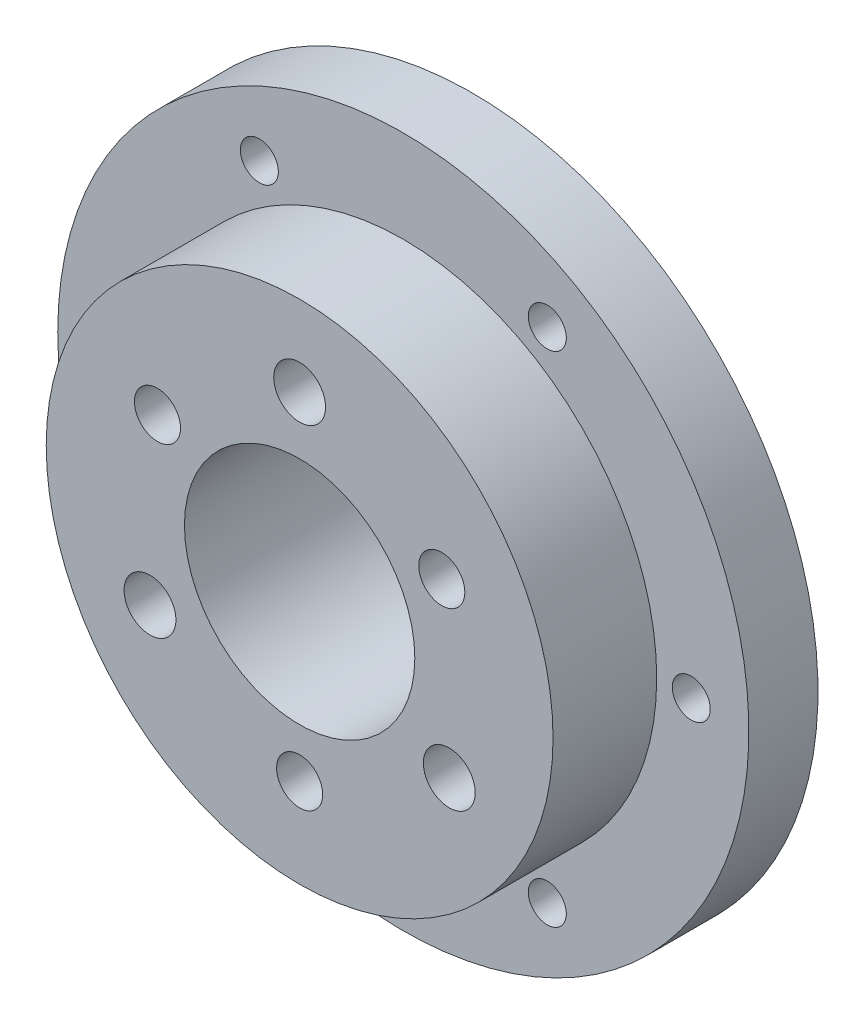
ISO-10303-21;
HEADER;
FILE_DESCRIPTION(('STEP AP214'),'2;1');
FILE_NAME('part.step','',(''),(''),'','','');
FILE_SCHEMA(('AUTOMOTIVE_DESIGN { 1 0 10303 214 1 1 1 1 }'));
ENDSEC;
DATA;
#1=APPLICATION_CONTEXT('core data for automotive mechanical design processes');
#2=APPLICATION_PROTOCOL_DEFINITION('international standard','automotive_design',2000,#1);
#3=PRODUCT_CONTEXT('',#1,'mechanical');
#4=PRODUCT('Part','Part','',(#3));
#5=PRODUCT_RELATED_PRODUCT_CATEGORY('part','',(#4));
#6=PRODUCT_DEFINITION_FORMATION('','',#4);
#7=PRODUCT_DEFINITION_CONTEXT('part definition',#1,'design');
#8=PRODUCT_DEFINITION('design','',#6,#7);
#9=PRODUCT_DEFINITION_SHAPE('','',#8);
#10=(LENGTH_UNIT() NAMED_UNIT(*) SI_UNIT(.MILLI.,.METRE.));
#11=(NAMED_UNIT(*) PLANE_ANGLE_UNIT() SI_UNIT($,.RADIAN.));
#12=(NAMED_UNIT(*) SI_UNIT($,.STERADIAN.) SOLID_ANGLE_UNIT());
#13=UNCERTAINTY_MEASURE_WITH_UNIT(LENGTH_MEASURE(1.E-05),#10,'distance_accuracy_value','');
#14=(GEOMETRIC_REPRESENTATION_CONTEXT(3) GLOBAL_UNCERTAINTY_ASSIGNED_CONTEXT((#13)) GLOBAL_UNIT_ASSIGNED_CONTEXT((#10,
#11,#12)) REPRESENTATION_CONTEXT('',''));
#15=CARTESIAN_POINT('',(0.,0.,0.));
#16=DIRECTION('',(0.,0.,1.));
#17=DIRECTION('',(1.,0.,0.));
#18=AXIS2_PLACEMENT_3D('',#15,#16,#17);
#19=CARTESIAN_POINT('',(0.,0.,0.));
#20=DIRECTION('',(0.,0.,1.));
#21=DIRECTION('',(1.,0.,0.));
#22=AXIS2_PLACEMENT_3D('',#19,#20,#21);
#23=PLANE('',#22);
#24=CARTESIAN_POINT('',(25.,0.,0.));
#25=DIRECTION('',(0.,0.,-1.));
#26=DIRECTION('',(-1.,0.,0.));
#27=AXIS2_PLACEMENT_3D('',#24,#25,#26);
#28=CIRCLE('',#27,1.65);
#29=CARTESIAN_POINT('',(23.35,0.,0.));
#30=VERTEX_POINT('',#29);
#31=EDGE_CURVE('E69',#30,#30,#28,.T.);
#32=ORIENTED_EDGE('',*,*,#31,.F.);
#33=EDGE_LOOP('',(#32));
#34=FACE_BOUND('',#33,.T.);
#35=CARTESIAN_POINT('',(12.5,21.650635094611,0.));
#36=DIRECTION('',(0.,0.,-1.));
#37=DIRECTION('',(-1.,0.,0.));
#38=AXIS2_PLACEMENT_3D('',#35,#36,#37);
#39=CIRCLE('',#38,1.65);
#40=CARTESIAN_POINT('',(10.85,21.650635094611,0.));
#41=VERTEX_POINT('',#40);
#42=EDGE_CURVE('E58',#41,#41,#39,.T.);
#43=ORIENTED_EDGE('',*,*,#42,.F.);
#44=EDGE_LOOP('',(#43));
#45=FACE_BOUND('',#44,.T.);
#46=CARTESIAN_POINT('',(-25.,-1.74574066942157E-13,0.));
#47=DIRECTION('',(0.,0.,-1.));
#48=DIRECTION('',(-1.,0.,0.));
#49=AXIS2_PLACEMENT_3D('',#46,#47,#48);
#50=CIRCLE('',#49,1.65);
#51=CARTESIAN_POINT('',(-26.65,-1.74574066942157E-13,0.));
#52=VERTEX_POINT('',#51);
#53=EDGE_CURVE('E74',#52,#52,#50,.T.);
#54=ORIENTED_EDGE('',*,*,#53,.F.);
#55=EDGE_LOOP('',(#54));
#56=FACE_BOUND('',#55,.T.);
#57=CARTESIAN_POINT('',(-12.4999999999998,-21.6506350946111,0.));
#58=DIRECTION('',(0.,0.,-1.));
#59=DIRECTION('',(-1.,0.,0.));
#60=AXIS2_PLACEMENT_3D('',#57,#58,#59);
#61=CIRCLE('',#60,1.65);
#62=CARTESIAN_POINT('',(-14.1499999999998,-21.6506350946111,0.));
#63=VERTEX_POINT('',#62);
#64=EDGE_CURVE('E80',#63,#63,#61,.T.);
#65=ORIENTED_EDGE('',*,*,#64,.F.);
#66=EDGE_LOOP('',(#65));
#67=FACE_BOUND('',#66,.T.);
#68=CARTESIAN_POINT('',(12.5000000000003,-21.6506350946108,0.));
#69=DIRECTION('',(0.,0.,-1.));
#70=DIRECTION('',(-1.,0.,0.));
#71=AXIS2_PLACEMENT_3D('',#68,#69,#70);
#72=CIRCLE('',#71,1.65);
#73=CARTESIAN_POINT('',(10.8500000000003,-21.6506350946108,0.));
#74=VERTEX_POINT('',#73);
#75=EDGE_CURVE('E86',#74,#74,#72,.T.);
#76=ORIENTED_EDGE('',*,*,#75,.F.);
#77=EDGE_LOOP('',(#76));
#78=FACE_BOUND('',#77,.T.);
#79=CARTESIAN_POINT('',(12.9903810567666,-7.50000000000001,0.));
#80=DIRECTION('',(0.,0.,-1.));
#81=DIRECTION('',(-1.,0.,0.));
#82=AXIS2_PLACEMENT_3D('',#79,#80,#81);
#83=CIRCLE('',#82,4.);
#84=CARTESIAN_POINT('',(8.99038105676658,-7.50000000000001,0.));
#85=VERTEX_POINT('',#84);
#86=EDGE_CURVE('E92',#85,#85,#83,.T.);
#87=ORIENTED_EDGE('',*,*,#86,.F.);
#88=EDGE_LOOP('',(#87));
#89=FACE_BOUND('',#88,.T.);
#90=CARTESIAN_POINT('',(-12.9903810567666,-7.5,0.));
#91=DIRECTION('',(0.,0.,-1.));
#92=DIRECTION('',(-1.,0.,0.));
#93=AXIS2_PLACEMENT_3D('',#90,#91,#92);
#94=CIRCLE('',#93,4.);
#95=CARTESIAN_POINT('',(-16.9903810567666,-7.5,0.));
#96=VERTEX_POINT('',#95);
#97=EDGE_CURVE('E104',#96,#96,#94,.T.);
#98=ORIENTED_EDGE('',*,*,#97,.F.);
#99=EDGE_LOOP('',(#98));
#100=FACE_BOUND('',#99,.T.);
#101=CARTESIAN_POINT('',(0.,15.,0.));
#102=DIRECTION('',(0.,0.,-1.));
#103=DIRECTION('',(-1.,0.,0.));
#104=AXIS2_PLACEMENT_3D('',#101,#102,#103);
#105=CIRCLE('',#104,4.);
#106=CARTESIAN_POINT('',(-4.,15.,0.));
#107=VERTEX_POINT('',#106);
#108=EDGE_CURVE('E116',#107,#107,#105,.T.);
#109=ORIENTED_EDGE('',*,*,#108,.F.);
#110=EDGE_LOOP('',(#109));
#111=FACE_BOUND('',#110,.T.);
#112=CARTESIAN_POINT('',(0.,0.,0.));
#113=DIRECTION('',(0.,0.,-1.));
#114=DIRECTION('',(-1.,0.,0.));
#115=AXIS2_PLACEMENT_3D('',#112,#113,#114);
#116=CIRCLE('',#115,10.);
#117=CARTESIAN_POINT('',(-10.,0.,0.));
#118=VERTEX_POINT('',#117);
#119=EDGE_CURVE('E128',#118,#118,#116,.T.);
#120=ORIENTED_EDGE('',*,*,#119,.F.);
#121=EDGE_LOOP('',(#120));
#122=FACE_BOUND('',#121,.T.);
#123=CARTESIAN_POINT('',(-12.3408620039283,7.125,0.));
#124=DIRECTION('',(0.,0.,1.));
#125=DIRECTION('',(1.,0.,0.));
#126=AXIS2_PLACEMENT_3D('',#123,#124,#125);
#127=CIRCLE('',#126,2.);
#128=CARTESIAN_POINT('',(-10.3408620039283,7.125,0.));
#129=VERTEX_POINT('',#128);
#130=EDGE_CURVE('E135',#129,#129,#127,.T.);
#131=ORIENTED_EDGE('',*,*,#130,.T.);
#132=EDGE_LOOP('',(#131));
#133=FACE_BOUND('',#132,.T.);
#134=CARTESIAN_POINT('',(12.3408620039283,7.125,0.));
#135=DIRECTION('',(0.,0.,1.));
#136=DIRECTION('',(1.,0.,0.));
#137=AXIS2_PLACEMENT_3D('',#134,#135,#136);
#138=CIRCLE('',#137,2.);
#139=CARTESIAN_POINT('',(14.3408620039283,7.125,0.));
#140=VERTEX_POINT('',#139);
#141=EDGE_CURVE('E139',#140,#140,#138,.T.);
#142=ORIENTED_EDGE('',*,*,#141,.T.);
#143=EDGE_LOOP('',(#142));
#144=FACE_BOUND('',#143,.T.);
#145=CARTESIAN_POINT('',(0.,-14.25,0.));
#146=DIRECTION('',(0.,0.,1.));
#147=DIRECTION('',(1.,0.,0.));
#148=AXIS2_PLACEMENT_3D('',#145,#146,#147);
#149=CIRCLE('',#148,2.);
#150=CARTESIAN_POINT('',(2.,-14.25,0.));
#151=VERTEX_POINT('',#150);
#152=EDGE_CURVE('E132',#151,#151,#149,.T.);
#153=ORIENTED_EDGE('',*,*,#152,.T.);
#154=EDGE_LOOP('',(#153));
#155=FACE_BOUND('',#154,.T.);
#156=CARTESIAN_POINT('',(0.,0.,0.));
#157=DIRECTION('',(0.,0.,-1.));
#158=DIRECTION('',(-1.,0.,0.));
#159=AXIS2_PLACEMENT_3D('',#156,#157,#158);
#160=CIRCLE('',#159,30.);
#161=CARTESIAN_POINT('',(-30.,0.,0.));
#162=VERTEX_POINT('',#161);
#163=EDGE_CURVE('E152',#162,#162,#160,.T.);
#164=ORIENTED_EDGE('',*,*,#163,.T.);
#165=EDGE_LOOP('',(#164));
#166=FACE_BOUND('',#165,.T.);
#167=CARTESIAN_POINT('',(-12.5000000000001,21.6506350946109,0.));
#168=DIRECTION('',(0.,0.,-1.));
#169=DIRECTION('',(-1.,0.,0.));
#170=AXIS2_PLACEMENT_3D('',#167,#168,#169);
#171=CIRCLE('',#170,1.65);
#172=CARTESIAN_POINT('',(-14.1500000000001,21.6506350946109,0.));
#173=VERTEX_POINT('',#172);
#174=EDGE_CURVE('E57',#173,#173,#171,.T.);
#175=ORIENTED_EDGE('',*,*,#174,.F.);
#176=EDGE_LOOP('',(#175));
#177=FACE_BOUND('',#176,.T.);
#178=ADVANCED_FACE('F39',(#34,#45,#56,#67,#78,#89,#100,#111,#122,#133,#144,#155,#166,#177),#23,.F.);
#179=CARTESIAN_POINT('',(0.,0.,15.));
#180=DIRECTION('',(0.,0.,-1.));
#181=DIRECTION('',(-1.,0.,0.));
#182=AXIS2_PLACEMENT_3D('',#179,#180,#181);
#183=CYLINDRICAL_SURFACE('',#182,22.);
#184=CARTESIAN_POINT('',(0.,0.,15.));
#185=DIRECTION('',(0.,0.,1.));
#186=DIRECTION('',(1.,0.,0.));
#187=AXIS2_PLACEMENT_3D('',#184,#185,#186);
#188=CIRCLE('',#187,22.);
#189=CARTESIAN_POINT('',(22.,0.,15.));
#190=VERTEX_POINT('',#189);
#191=EDGE_CURVE('E47',#190,#190,#188,.T.);
#192=ORIENTED_EDGE('',*,*,#191,.F.);
#193=EDGE_LOOP('',(#192));
#194=FACE_BOUND('',#193,.T.);
#195=CARTESIAN_POINT('',(0.,0.,6.));
#196=DIRECTION('',(0.,0.,-1.));
#197=DIRECTION('',(-1.,0.,0.));
#198=AXIS2_PLACEMENT_3D('',#195,#196,#197);
#199=CIRCLE('',#198,22.);
#200=CARTESIAN_POINT('',(-22.,0.,6.));
#201=VERTEX_POINT('',#200);
#202=EDGE_CURVE('E10',#201,#201,#199,.T.);
#203=ORIENTED_EDGE('',*,*,#202,.F.);
#204=EDGE_LOOP('',(#203));
#205=FACE_BOUND('',#204,.T.);
#206=ADVANCED_FACE('F41',(#194,#205),#183,.T.);
#207=CARTESIAN_POINT('',(0.,0.,15.));
#208=DIRECTION('',(0.,0.,1.));
#209=DIRECTION('',(1.,0.,0.));
#210=AXIS2_PLACEMENT_3D('',#207,#208,#209);
#211=PLANE('',#210);
#212=CARTESIAN_POINT('',(12.9903810567666,-7.50000000000001,15.));
#213=DIRECTION('',(0.,0.,-1.));
#214=DIRECTION('',(-1.,0.,0.));
#215=AXIS2_PLACEMENT_3D('',#212,#213,#214);
#216=CIRCLE('',#215,2.25);
#217=CARTESIAN_POINT('',(10.7403810567666,-7.50000000000001,15.));
#218=VERTEX_POINT('',#217);
#219=EDGE_CURVE('E101',#218,#218,#216,.T.);
#220=ORIENTED_EDGE('',*,*,#219,.T.);
#221=EDGE_LOOP('',(#220));
#222=FACE_BOUND('',#221,.T.);
#223=CARTESIAN_POINT('',(-12.9903810567666,-7.5,15.));
#224=DIRECTION('',(0.,0.,-1.));
#225=DIRECTION('',(-1.,0.,0.));
#226=AXIS2_PLACEMENT_3D('',#223,#224,#225);
#227=CIRCLE('',#226,2.25);
#228=CARTESIAN_POINT('',(-15.2403810567666,-7.5,15.));
#229=VERTEX_POINT('',#228);
#230=EDGE_CURVE('E113',#229,#229,#227,.T.);
#231=ORIENTED_EDGE('',*,*,#230,.T.);
#232=EDGE_LOOP('',(#231));
#233=FACE_BOUND('',#232,.T.);
#234=CARTESIAN_POINT('',(0.,15.,15.));
#235=DIRECTION('',(0.,0.,-1.));
#236=DIRECTION('',(-1.,0.,0.));
#237=AXIS2_PLACEMENT_3D('',#234,#235,#236);
#238=CIRCLE('',#237,2.25);
#239=CARTESIAN_POINT('',(-2.25,15.,15.));
#240=VERTEX_POINT('',#239);
#241=EDGE_CURVE('E125',#240,#240,#238,.T.);
#242=ORIENTED_EDGE('',*,*,#241,.T.);
#243=EDGE_LOOP('',(#242));
#244=FACE_BOUND('',#243,.T.);
#245=CARTESIAN_POINT('',(0.,0.,15.));
#246=DIRECTION('',(0.,0.,-1.));
#247=DIRECTION('',(-1.,0.,0.));
#248=AXIS2_PLACEMENT_3D('',#245,#246,#247);
#249=CIRCLE('',#248,10.);
#250=CARTESIAN_POINT('',(-10.,0.,15.));
#251=VERTEX_POINT('',#250);
#252=EDGE_CURVE('E129',#251,#251,#249,.T.);
#253=ORIENTED_EDGE('',*,*,#252,.T.);
#254=EDGE_LOOP('',(#253));
#255=FACE_BOUND('',#254,.T.);
#256=CARTESIAN_POINT('',(-12.3408620039283,7.125,15.));
#257=DIRECTION('',(0.,0.,1.));
#258=DIRECTION('',(1.,0.,0.));
#259=AXIS2_PLACEMENT_3D('',#256,#257,#258);
#260=CIRCLE('',#259,2.);
#261=CARTESIAN_POINT('',(-10.3408620039283,7.125,15.));
#262=VERTEX_POINT('',#261);
#263=EDGE_CURVE('E149',#262,#262,#260,.T.);
#264=ORIENTED_EDGE('',*,*,#263,.F.);
#265=EDGE_LOOP('',(#264));
#266=FACE_BOUND('',#265,.T.);
#267=CARTESIAN_POINT('',(12.3408620039283,7.125,15.));
#268=DIRECTION('',(0.,0.,1.));
#269=DIRECTION('',(1.,0.,0.));
#270=AXIS2_PLACEMENT_3D('',#267,#268,#269);
#271=CIRCLE('',#270,2.);
#272=CARTESIAN_POINT('',(14.3408620039283,7.125,15.));
#273=VERTEX_POINT('',#272);
#274=EDGE_CURVE('E146',#273,#273,#271,.T.);
#275=ORIENTED_EDGE('',*,*,#274,.F.);
#276=EDGE_LOOP('',(#275));
#277=FACE_BOUND('',#276,.T.);
#278=CARTESIAN_POINT('',(0.,-14.25,15.));
#279=DIRECTION('',(0.,0.,1.));
#280=DIRECTION('',(1.,0.,0.));
#281=AXIS2_PLACEMENT_3D('',#278,#279,#280);
#282=CIRCLE('',#281,2.);
#283=CARTESIAN_POINT('',(2.,-14.25,15.));
#284=VERTEX_POINT('',#283);
#285=EDGE_CURVE('E138',#284,#284,#282,.T.);
#286=ORIENTED_EDGE('',*,*,#285,.F.);
#287=EDGE_LOOP('',(#286));
#288=FACE_BOUND('',#287,.T.);
#289=ORIENTED_EDGE('',*,*,#191,.T.);
#290=EDGE_LOOP('',(#289));
#291=FACE_BOUND('',#290,.T.);
#292=ADVANCED_FACE('F162',(#222,#233,#244,#255,#266,#277,#288,#291),#211,.T.);
#293=CARTESIAN_POINT('',(0.,0.,6.));
#294=DIRECTION('',(0.,0.,-1.));
#295=DIRECTION('',(-1.,0.,0.));
#296=AXIS2_PLACEMENT_3D('',#293,#294,#295);
#297=CYLINDRICAL_SURFACE('',#296,30.);
#298=CARTESIAN_POINT('',(0.,0.,6.));
#299=DIRECTION('',(0.,0.,-1.));
#300=DIRECTION('',(-1.,0.,0.));
#301=AXIS2_PLACEMENT_3D('',#298,#299,#300);
#302=CIRCLE('',#301,30.);
#303=CARTESIAN_POINT('',(-30.,0.,6.));
#304=VERTEX_POINT('',#303);
#305=EDGE_CURVE('E52',#304,#304,#302,.T.);
#306=ORIENTED_EDGE('',*,*,#305,.T.);
#307=EDGE_LOOP('',(#306));
#308=FACE_BOUND('',#307,.T.);
#309=ORIENTED_EDGE('',*,*,#163,.F.);
#310=EDGE_LOOP('',(#309));
#311=FACE_BOUND('',#310,.T.);
#312=ADVANCED_FACE('F159',(#308,#311),#297,.T.);
#313=CARTESIAN_POINT('',(0.,0.,6.));
#314=DIRECTION('',(0.,0.,-1.));
#315=DIRECTION('',(-1.,0.,0.));
#316=AXIS2_PLACEMENT_3D('',#313,#314,#315);
#317=PLANE('',#316);
#318=CARTESIAN_POINT('',(25.,0.,6.));
#319=DIRECTION('',(0.,0.,-1.));
#320=DIRECTION('',(-1.,0.,0.));
#321=AXIS2_PLACEMENT_3D('',#318,#319,#320);
#322=CIRCLE('',#321,1.65);
#323=CARTESIAN_POINT('',(23.35,0.,6.));
#324=VERTEX_POINT('',#323);
#325=EDGE_CURVE('E43',#324,#324,#322,.T.);
#326=ORIENTED_EDGE('',*,*,#325,.T.);
#327=EDGE_LOOP('',(#326));
#328=FACE_BOUND('',#327,.T.);
#329=CARTESIAN_POINT('',(12.5,21.650635094611,6.));
#330=DIRECTION('',(0.,0.,-1.));
#331=DIRECTION('',(-1.,0.,0.));
#332=AXIS2_PLACEMENT_3D('',#329,#330,#331);
#333=CIRCLE('',#332,1.65);
#334=CARTESIAN_POINT('',(10.85,21.650635094611,6.));
#335=VERTEX_POINT('',#334);
#336=EDGE_CURVE('E55',#335,#335,#333,.T.);
#337=ORIENTED_EDGE('',*,*,#336,.T.);
#338=EDGE_LOOP('',(#337));
#339=FACE_BOUND('',#338,.T.);
#340=CARTESIAN_POINT('',(-12.5000000000001,21.6506350946109,6.));
#341=DIRECTION('',(0.,0.,-1.));
#342=DIRECTION('',(-1.,0.,0.));
#343=AXIS2_PLACEMENT_3D('',#340,#341,#342);
#344=CIRCLE('',#343,1.65);
#345=CARTESIAN_POINT('',(-14.1500000000001,21.6506350946109,6.));
#346=VERTEX_POINT('',#345);
#347=EDGE_CURVE('E62',#346,#346,#344,.T.);
#348=ORIENTED_EDGE('',*,*,#347,.T.);
#349=EDGE_LOOP('',(#348));
#350=FACE_BOUND('',#349,.T.);
#351=CARTESIAN_POINT('',(-25.,-1.74574066942157E-13,6.));
#352=DIRECTION('',(0.,0.,-1.));
#353=DIRECTION('',(-1.,0.,0.));
#354=AXIS2_PLACEMENT_3D('',#351,#352,#353);
#355=CIRCLE('',#354,1.65);
#356=CARTESIAN_POINT('',(-26.65,-1.74574066942157E-13,6.));
#357=VERTEX_POINT('',#356);
#358=EDGE_CURVE('E77',#357,#357,#355,.T.);
#359=ORIENTED_EDGE('',*,*,#358,.T.);
#360=EDGE_LOOP('',(#359));
#361=FACE_BOUND('',#360,.T.);
#362=CARTESIAN_POINT('',(-12.4999999999998,-21.6506350946111,6.));
#363=DIRECTION('',(0.,0.,-1.));
#364=DIRECTION('',(-1.,0.,0.));
#365=AXIS2_PLACEMENT_3D('',#362,#363,#364);
#366=CIRCLE('',#365,1.65);
#367=CARTESIAN_POINT('',(-14.1499999999998,-21.6506350946111,6.));
#368=VERTEX_POINT('',#367);
#369=EDGE_CURVE('E83',#368,#368,#366,.T.);
#370=ORIENTED_EDGE('',*,*,#369,.T.);
#371=EDGE_LOOP('',(#370));
#372=FACE_BOUND('',#371,.T.);
#373=CARTESIAN_POINT('',(12.5000000000003,-21.6506350946108,6.));
#374=DIRECTION('',(0.,0.,-1.));
#375=DIRECTION('',(-1.,0.,0.));
#376=AXIS2_PLACEMENT_3D('',#373,#374,#375);
#377=CIRCLE('',#376,1.65);
#378=CARTESIAN_POINT('',(10.8500000000003,-21.6506350946108,6.));
#379=VERTEX_POINT('',#378);
#380=EDGE_CURVE('E89',#379,#379,#377,.T.);
#381=ORIENTED_EDGE('',*,*,#380,.T.);
#382=EDGE_LOOP('',(#381));
#383=FACE_BOUND('',#382,.T.);
#384=ORIENTED_EDGE('',*,*,#202,.T.);
#385=EDGE_LOOP('',(#384));
#386=FACE_BOUND('',#385,.T.);
#387=ORIENTED_EDGE('',*,*,#305,.F.);
#388=EDGE_LOOP('',(#387));
#389=FACE_BOUND('',#388,.T.);
#390=ADVANCED_FACE('F161',(#328,#339,#350,#361,#372,#383,#386,#389),#317,.F.);
#391=CARTESIAN_POINT('',(0.,-14.25,0.));
#392=DIRECTION('',(0.,0.,1.));
#393=DIRECTION('',(1.,0.,0.));
#394=AXIS2_PLACEMENT_3D('',#391,#392,#393);
#395=CYLINDRICAL_SURFACE('',#394,2.);
#396=ORIENTED_EDGE('',*,*,#285,.T.);
#397=EDGE_LOOP('',(#396));
#398=FACE_BOUND('',#397,.T.);
#399=ORIENTED_EDGE('',*,*,#152,.F.);
#400=EDGE_LOOP('',(#399));
#401=FACE_BOUND('',#400,.T.);
#402=ADVANCED_FACE('F169',(#398,#401),#395,.F.);
#403=CARTESIAN_POINT('',(12.3408620039283,7.125,0.));
#404=DIRECTION('',(0.,0.,1.));
#405=DIRECTION('',(1.,0.,0.));
#406=AXIS2_PLACEMENT_3D('',#403,#404,#405);
#407=CYLINDRICAL_SURFACE('',#406,2.);
#408=ORIENTED_EDGE('',*,*,#274,.T.);
#409=EDGE_LOOP('',(#408));
#410=FACE_BOUND('',#409,.T.);
#411=ORIENTED_EDGE('',*,*,#141,.F.);
#412=EDGE_LOOP('',(#411));
#413=FACE_BOUND('',#412,.T.);
#414=ADVANCED_FACE('F205',(#410,#413),#407,.F.);
#415=CARTESIAN_POINT('',(-12.3408620039283,7.125,0.));
#416=DIRECTION('',(0.,0.,1.));
#417=DIRECTION('',(1.,0.,0.));
#418=AXIS2_PLACEMENT_3D('',#415,#416,#417);
#419=CYLINDRICAL_SURFACE('',#418,2.);
#420=ORIENTED_EDGE('',*,*,#263,.T.);
#421=EDGE_LOOP('',(#420));
#422=FACE_BOUND('',#421,.T.);
#423=ORIENTED_EDGE('',*,*,#130,.F.);
#424=EDGE_LOOP('',(#423));
#425=FACE_BOUND('',#424,.T.);
#426=ADVANCED_FACE('F211',(#422,#425),#419,.F.);
#427=CARTESIAN_POINT('',(0.,0.,15.));
#428=DIRECTION('',(0.,0.,-1.));
#429=DIRECTION('',(-1.,0.,0.));
#430=AXIS2_PLACEMENT_3D('',#427,#428,#429);
#431=CYLINDRICAL_SURFACE('',#430,10.);
#432=ORIENTED_EDGE('',*,*,#252,.F.);
#433=EDGE_LOOP('',(#432));
#434=FACE_BOUND('',#433,.T.);
#435=ORIENTED_EDGE('',*,*,#119,.T.);
#436=EDGE_LOOP('',(#435));
#437=FACE_BOUND('',#436,.T.);
#438=ADVANCED_FACE('F217',(#434,#437),#431,.F.);
#439=CARTESIAN_POINT('',(0.,15.,0.));
#440=DIRECTION('',(0.,0.,-1.));
#441=DIRECTION('',(-1.,0.,0.));
#442=AXIS2_PLACEMENT_3D('',#439,#440,#441);
#443=CYLINDRICAL_SURFACE('',#442,2.25);
#444=ORIENTED_EDGE('',*,*,#241,.F.);
#445=EDGE_LOOP('',(#444));
#446=FACE_BOUND('',#445,.T.);
#447=CARTESIAN_POINT('',(0.,15.,4.6));
#448=DIRECTION('',(0.,0.,-1.));
#449=DIRECTION('',(-1.,0.,0.));
#450=AXIS2_PLACEMENT_3D('',#447,#448,#449);
#451=CIRCLE('',#450,2.25);
#452=CARTESIAN_POINT('',(-2.25,15.,4.6));
#453=VERTEX_POINT('',#452);
#454=EDGE_CURVE('E122',#453,#453,#451,.T.);
#455=ORIENTED_EDGE('',*,*,#454,.T.);
#456=EDGE_LOOP('',(#455));
#457=FACE_BOUND('',#456,.T.);
#458=ADVANCED_FACE('F221',(#446,#457),#443,.F.);
#459=CARTESIAN_POINT('',(2.25,15.,4.6));
#460=DIRECTION('',(0.,0.,1.));
#461=DIRECTION('',(1.,0.,0.));
#462=AXIS2_PLACEMENT_3D('',#459,#460,#461);
#463=PLANE('',#462);
#464=ORIENTED_EDGE('',*,*,#454,.F.);
#465=EDGE_LOOP('',(#464));
#466=FACE_BOUND('',#465,.T.);
#467=CARTESIAN_POINT('',(0.,15.,4.6));
#468=DIRECTION('',(0.,0.,-1.));
#469=DIRECTION('',(-1.,0.,0.));
#470=AXIS2_PLACEMENT_3D('',#467,#468,#469);
#471=CIRCLE('',#470,4.);
#472=CARTESIAN_POINT('',(-4.,15.,4.6));
#473=VERTEX_POINT('',#472);
#474=EDGE_CURVE('E119',#473,#473,#471,.T.);
#475=ORIENTED_EDGE('',*,*,#474,.T.);
#476=EDGE_LOOP('',(#475));
#477=FACE_BOUND('',#476,.T.);
#478=ADVANCED_FACE('F225',(#466,#477),#463,.F.);
#479=CARTESIAN_POINT('',(0.,15.,0.));
#480=DIRECTION('',(0.,0.,-1.));
#481=DIRECTION('',(-1.,0.,0.));
#482=AXIS2_PLACEMENT_3D('',#479,#480,#481);
#483=CYLINDRICAL_SURFACE('',#482,4.);
#484=ORIENTED_EDGE('',*,*,#474,.F.);
#485=EDGE_LOOP('',(#484));
#486=FACE_BOUND('',#485,.T.);
#487=ORIENTED_EDGE('',*,*,#108,.T.);
#488=EDGE_LOOP('',(#487));
#489=FACE_BOUND('',#488,.T.);
#490=ADVANCED_FACE('F229',(#486,#489),#483,.F.);
#491=CARTESIAN_POINT('',(-12.9903810567666,-7.5,0.));
#492=DIRECTION('',(0.,0.,-1.));
#493=DIRECTION('',(-1.,0.,0.));
#494=AXIS2_PLACEMENT_3D('',#491,#492,#493);
#495=CYLINDRICAL_SURFACE('',#494,2.25);
#496=ORIENTED_EDGE('',*,*,#230,.F.);
#497=EDGE_LOOP('',(#496));
#498=FACE_BOUND('',#497,.T.);
#499=CARTESIAN_POINT('',(-12.9903810567666,-7.5,4.6));
#500=DIRECTION('',(0.,0.,-1.));
#501=DIRECTION('',(-1.,0.,0.));
#502=AXIS2_PLACEMENT_3D('',#499,#500,#501);
#503=CIRCLE('',#502,2.25);
#504=CARTESIAN_POINT('',(-15.2403810567666,-7.5,4.6));
#505=VERTEX_POINT('',#504);
#506=EDGE_CURVE('E110',#505,#505,#503,.T.);
#507=ORIENTED_EDGE('',*,*,#506,.T.);
#508=EDGE_LOOP('',(#507));
#509=FACE_BOUND('',#508,.T.);
#510=ADVANCED_FACE('F233',(#498,#509),#495,.F.);
#511=CARTESIAN_POINT('',(-10.7403810567666,-7.5,4.6));
#512=DIRECTION('',(0.,0.,1.));
#513=DIRECTION('',(1.,0.,0.));
#514=AXIS2_PLACEMENT_3D('',#511,#512,#513);
#515=PLANE('',#514);
#516=ORIENTED_EDGE('',*,*,#506,.F.);
#517=EDGE_LOOP('',(#516));
#518=FACE_BOUND('',#517,.T.);
#519=CARTESIAN_POINT('',(-12.9903810567666,-7.5,4.6));
#520=DIRECTION('',(0.,0.,-1.));
#521=DIRECTION('',(-1.,0.,0.));
#522=AXIS2_PLACEMENT_3D('',#519,#520,#521);
#523=CIRCLE('',#522,4.);
#524=CARTESIAN_POINT('',(-16.9903810567666,-7.5,4.6));
#525=VERTEX_POINT('',#524);
#526=EDGE_CURVE('E107',#525,#525,#523,.T.);
#527=ORIENTED_EDGE('',*,*,#526,.T.);
#528=EDGE_LOOP('',(#527));
#529=FACE_BOUND('',#528,.T.);
#530=ADVANCED_FACE('F237',(#518,#529),#515,.F.);
#531=CARTESIAN_POINT('',(-12.9903810567666,-7.5,0.));
#532=DIRECTION('',(0.,0.,-1.));
#533=DIRECTION('',(-1.,0.,0.));
#534=AXIS2_PLACEMENT_3D('',#531,#532,#533);
#535=CYLINDRICAL_SURFACE('',#534,4.);
#536=ORIENTED_EDGE('',*,*,#526,.F.);
#537=EDGE_LOOP('',(#536));
#538=FACE_BOUND('',#537,.T.);
#539=ORIENTED_EDGE('',*,*,#97,.T.);
#540=EDGE_LOOP('',(#539));
#541=FACE_BOUND('',#540,.T.);
#542=ADVANCED_FACE('F241',(#538,#541),#535,.F.);
#543=CARTESIAN_POINT('',(12.9903810567666,-7.50000000000001,0.));
#544=DIRECTION('',(0.,0.,-1.));
#545=DIRECTION('',(-1.,0.,0.));
#546=AXIS2_PLACEMENT_3D('',#543,#544,#545);
#547=CYLINDRICAL_SURFACE('',#546,2.25);
#548=ORIENTED_EDGE('',*,*,#219,.F.);
#549=EDGE_LOOP('',(#548));
#550=FACE_BOUND('',#549,.T.);
#551=CARTESIAN_POINT('',(12.9903810567666,-7.50000000000001,4.6));
#552=DIRECTION('',(0.,0.,-1.));
#553=DIRECTION('',(-1.,0.,0.));
#554=AXIS2_PLACEMENT_3D('',#551,#552,#553);
#555=CIRCLE('',#554,2.25);
#556=CARTESIAN_POINT('',(10.7403810567666,-7.50000000000001,4.6));
#557=VERTEX_POINT('',#556);
#558=EDGE_CURVE('E98',#557,#557,#555,.T.);
#559=ORIENTED_EDGE('',*,*,#558,.T.);
#560=EDGE_LOOP('',(#559));
#561=FACE_BOUND('',#560,.T.);
#562=ADVANCED_FACE('F245',(#550,#561),#547,.F.);
#563=CARTESIAN_POINT('',(15.2403810567666,-7.50000000000001,4.6));
#564=DIRECTION('',(0.,0.,1.));
#565=DIRECTION('',(1.,0.,0.));
#566=AXIS2_PLACEMENT_3D('',#563,#564,#565);
#567=PLANE('',#566);
#568=ORIENTED_EDGE('',*,*,#558,.F.);
#569=EDGE_LOOP('',(#568));
#570=FACE_BOUND('',#569,.T.);
#571=CARTESIAN_POINT('',(12.9903810567666,-7.50000000000001,4.6));
#572=DIRECTION('',(0.,0.,-1.));
#573=DIRECTION('',(-1.,0.,0.));
#574=AXIS2_PLACEMENT_3D('',#571,#572,#573);
#575=CIRCLE('',#574,4.);
#576=CARTESIAN_POINT('',(8.99038105676658,-7.50000000000001,4.6));
#577=VERTEX_POINT('',#576);
#578=EDGE_CURVE('E95',#577,#577,#575,.T.);
#579=ORIENTED_EDGE('',*,*,#578,.T.);
#580=EDGE_LOOP('',(#579));
#581=FACE_BOUND('',#580,.T.);
#582=ADVANCED_FACE('F249',(#570,#581),#567,.F.);
#583=CARTESIAN_POINT('',(12.9903810567666,-7.50000000000001,0.));
#584=DIRECTION('',(0.,0.,-1.));
#585=DIRECTION('',(-1.,0.,0.));
#586=AXIS2_PLACEMENT_3D('',#583,#584,#585);
#587=CYLINDRICAL_SURFACE('',#586,4.);
#588=ORIENTED_EDGE('',*,*,#578,.F.);
#589=EDGE_LOOP('',(#588));
#590=FACE_BOUND('',#589,.T.);
#591=ORIENTED_EDGE('',*,*,#86,.T.);
#592=EDGE_LOOP('',(#591));
#593=FACE_BOUND('',#592,.T.);
#594=ADVANCED_FACE('F253',(#590,#593),#587,.F.);
#595=CARTESIAN_POINT('',(12.5000000000003,-21.6506350946108,0.));
#596=DIRECTION('',(0.,0.,-1.));
#597=DIRECTION('',(-1.,0.,0.));
#598=AXIS2_PLACEMENT_3D('',#595,#596,#597);
#599=CYLINDRICAL_SURFACE('',#598,1.65);
#600=ORIENTED_EDGE('',*,*,#75,.T.);
#601=EDGE_LOOP('',(#600));
#602=FACE_BOUND('',#601,.T.);
#603=ORIENTED_EDGE('',*,*,#380,.F.);
#604=EDGE_LOOP('',(#603));
#605=FACE_BOUND('',#604,.T.);
#606=ADVANCED_FACE('F257',(#602,#605),#599,.F.);
#607=CARTESIAN_POINT('',(-12.4999999999998,-21.6506350946111,0.));
#608=DIRECTION('',(0.,0.,-1.));
#609=DIRECTION('',(-1.,0.,0.));
#610=AXIS2_PLACEMENT_3D('',#607,#608,#609);
#611=CYLINDRICAL_SURFACE('',#610,1.65);
#612=ORIENTED_EDGE('',*,*,#64,.T.);
#613=EDGE_LOOP('',(#612));
#614=FACE_BOUND('',#613,.T.);
#615=ORIENTED_EDGE('',*,*,#369,.F.);
#616=EDGE_LOOP('',(#615));
#617=FACE_BOUND('',#616,.T.);
#618=ADVANCED_FACE('F261',(#614,#617),#611,.F.);
#619=CARTESIAN_POINT('',(-25.,-1.74574066942157E-13,0.));
#620=DIRECTION('',(0.,0.,-1.));
#621=DIRECTION('',(-1.,0.,0.));
#622=AXIS2_PLACEMENT_3D('',#619,#620,#621);
#623=CYLINDRICAL_SURFACE('',#622,1.65);
#624=ORIENTED_EDGE('',*,*,#53,.T.);
#625=EDGE_LOOP('',(#624));
#626=FACE_BOUND('',#625,.T.);
#627=ORIENTED_EDGE('',*,*,#358,.F.);
#628=EDGE_LOOP('',(#627));
#629=FACE_BOUND('',#628,.T.);
#630=ADVANCED_FACE('F265',(#626,#629),#623,.F.);
#631=CARTESIAN_POINT('',(-12.5000000000001,21.6506350946109,0.));
#632=DIRECTION('',(0.,0.,-1.));
#633=DIRECTION('',(-1.,0.,0.));
#634=AXIS2_PLACEMENT_3D('',#631,#632,#633);
#635=CYLINDRICAL_SURFACE('',#634,1.65);
#636=ORIENTED_EDGE('',*,*,#174,.T.);
#637=EDGE_LOOP('',(#636));
#638=FACE_BOUND('',#637,.T.);
#639=ORIENTED_EDGE('',*,*,#347,.F.);
#640=EDGE_LOOP('',(#639));
#641=FACE_BOUND('',#640,.T.);
#642=ADVANCED_FACE('F269',(#638,#641),#635,.F.);
#643=CARTESIAN_POINT('',(12.5,21.650635094611,0.));
#644=DIRECTION('',(0.,0.,-1.));
#645=DIRECTION('',(-1.,0.,0.));
#646=AXIS2_PLACEMENT_3D('',#643,#644,#645);
#647=CYLINDRICAL_SURFACE('',#646,1.65);
#648=ORIENTED_EDGE('',*,*,#42,.T.);
#649=EDGE_LOOP('',(#648));
#650=FACE_BOUND('',#649,.T.);
#651=ORIENTED_EDGE('',*,*,#336,.F.);
#652=EDGE_LOOP('',(#651));
#653=FACE_BOUND('',#652,.T.);
#654=ADVANCED_FACE('F273',(#650,#653),#647,.F.);
#655=CARTESIAN_POINT('',(25.,0.,0.));
#656=DIRECTION('',(0.,0.,-1.));
#657=DIRECTION('',(-1.,0.,0.));
#658=AXIS2_PLACEMENT_3D('',#655,#656,#657);
#659=CYLINDRICAL_SURFACE('',#658,1.65);
#660=ORIENTED_EDGE('',*,*,#31,.T.);
#661=EDGE_LOOP('',(#660));
#662=FACE_BOUND('',#661,.T.);
#663=ORIENTED_EDGE('',*,*,#325,.F.);
#664=EDGE_LOOP('',(#663));
#665=FACE_BOUND('',#664,.T.);
#666=ADVANCED_FACE('F277',(#662,#665),#659,.F.);
#667=CLOSED_SHELL('',(#178,#206,#292,#312,#390,#402,#414,#426,#438,#458,#478,#490,#510,#530,
#542,#562,#582,#594,#606,#618,#630,#642,#654,#666));
#668=MANIFOLD_SOLID_BREP('B2',#667);
#669=ADVANCED_BREP_SHAPE_REPRESENTATION('',(#18,#668),#14);
#670=SHAPE_DEFINITION_REPRESENTATION(#9,#669);
ENDSEC;
END-ISO-10303-21;
